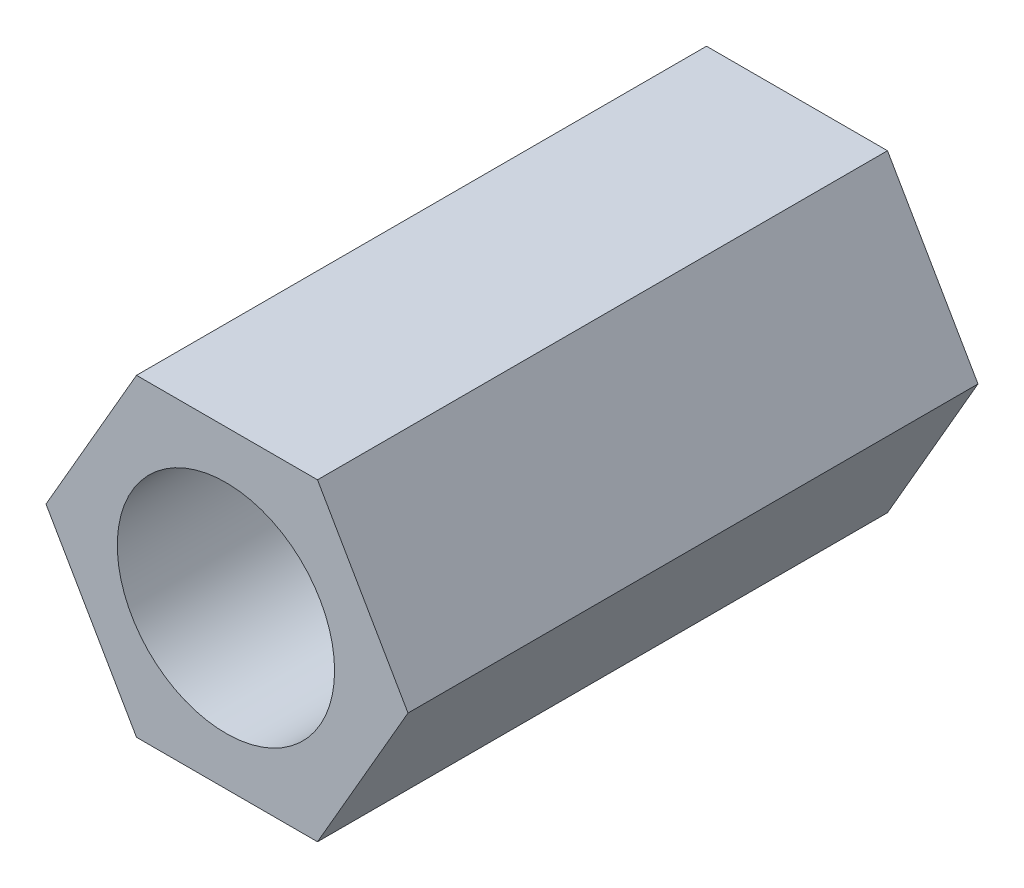
ISO-10303-21;
HEADER;
FILE_DESCRIPTION(('STEP AP214'),'2;1');
FILE_NAME('part.step','',(''),(''),'','','');
FILE_SCHEMA(('AUTOMOTIVE_DESIGN { 1 0 10303 214 1 1 1 1 }'));
ENDSEC;
DATA;
#1=APPLICATION_CONTEXT('core data for automotive mechanical design processes');
#2=APPLICATION_PROTOCOL_DEFINITION('international standard','automotive_design',2000,#1);
#3=PRODUCT_CONTEXT('',#1,'mechanical');
#4=PRODUCT('Part','Part','',(#3));
#5=PRODUCT_RELATED_PRODUCT_CATEGORY('part','',(#4));
#6=PRODUCT_DEFINITION_FORMATION('','',#4);
#7=PRODUCT_DEFINITION_CONTEXT('part definition',#1,'design');
#8=PRODUCT_DEFINITION('design','',#6,#7);
#9=PRODUCT_DEFINITION_SHAPE('','',#8);
#10=(LENGTH_UNIT() NAMED_UNIT(*) SI_UNIT(.MILLI.,.METRE.));
#11=(NAMED_UNIT(*) PLANE_ANGLE_UNIT() SI_UNIT($,.RADIAN.));
#12=(NAMED_UNIT(*) SI_UNIT($,.STERADIAN.) SOLID_ANGLE_UNIT());
#13=UNCERTAINTY_MEASURE_WITH_UNIT(LENGTH_MEASURE(1.E-05),#10,'distance_accuracy_value','');
#14=(GEOMETRIC_REPRESENTATION_CONTEXT(3) GLOBAL_UNCERTAINTY_ASSIGNED_CONTEXT((#13)) GLOBAL_UNIT_ASSIGNED_CONTEXT((#10,
#11,#12)) REPRESENTATION_CONTEXT('',''));
#15=CARTESIAN_POINT('',(0.,0.,0.));
#16=DIRECTION('',(0.,0.,1.));
#17=DIRECTION('',(1.,0.,0.));
#18=AXIS2_PLACEMENT_3D('',#15,#16,#17);
#19=CARTESIAN_POINT('',(12.7017059221717,0.,40.));
#20=DIRECTION('',(-0.866025403784438,-0.500000000000001,0.));
#21=DIRECTION('',(0.500000000000001,-0.866025403784438,0.));
#22=AXIS2_PLACEMENT_3D('',#19,#20,#21);
#23=PLANE('',#22);
#24=DIRECTION('',(0.,0.,1.));
#25=VECTOR('',#24,1.);
#26=CARTESIAN_POINT('',(6.35085296108583,11.,40.));
#27=LINE('',#26,#25);
#28=CARTESIAN_POINT('',(6.35085296108583,11.,0.));
#29=VERTEX_POINT('',#28);
#30=CARTESIAN_POINT('',(6.35085296108583,11.,40.));
#31=VERTEX_POINT('',#30);
#32=EDGE_CURVE('E46',#29,#31,#27,.T.);
#33=ORIENTED_EDGE('',*,*,#32,.T.);
#34=DIRECTION('',(-0.500000000000001,0.866025403784438,0.));
#35=VECTOR('',#34,1.);
#36=CARTESIAN_POINT('',(12.7017059221717,0.,40.));
#37=LINE('',#36,#35);
#38=CARTESIAN_POINT('',(12.7017059221717,0.,40.));
#39=VERTEX_POINT('',#38);
#40=EDGE_CURVE('E95',#39,#31,#37,.T.);
#41=ORIENTED_EDGE('',*,*,#40,.F.);
#42=DIRECTION('',(0.,0.,1.));
#43=VECTOR('',#42,1.);
#44=CARTESIAN_POINT('',(12.7017059221717,0.,40.));
#45=LINE('',#44,#43);
#46=CARTESIAN_POINT('',(12.7017059221717,0.,0.));
#47=VERTEX_POINT('',#46);
#48=EDGE_CURVE('E101',#39,#47,#45,.F.);
#49=ORIENTED_EDGE('',*,*,#48,.T.);
#50=DIRECTION('',(-0.500000000000001,0.866025403784438,0.));
#51=VECTOR('',#50,1.);
#52=CARTESIAN_POINT('',(12.7017059221717,0.,0.));
#53=LINE('',#52,#51);
#54=EDGE_CURVE('E150',#47,#29,#53,.T.);
#55=ORIENTED_EDGE('',*,*,#54,.T.);
#56=EDGE_LOOP('',(#33,#41,#49,#55));
#57=FACE_BOUND('',#56,.T.);
#58=ADVANCED_FACE('F43',(#57),#23,.F.);
#59=CARTESIAN_POINT('',(6.35085296108583,11.,40.));
#60=DIRECTION('',(0.,-1.,0.));
#61=DIRECTION('',(1.,0.,0.));
#62=AXIS2_PLACEMENT_3D('',#59,#60,#61);
#63=PLANE('',#62);
#64=DIRECTION('',(0.,0.,1.));
#65=VECTOR('',#64,1.);
#66=CARTESIAN_POINT('',(-6.35085296108591,10.9999999999999,40.));
#67=LINE('',#66,#65);
#68=CARTESIAN_POINT('',(-6.3508529610859,10.9999999999999,0.));
#69=VERTEX_POINT('',#68);
#70=CARTESIAN_POINT('',(-6.3508529610859,10.9999999999999,40.));
#71=VERTEX_POINT('',#70);
#72=EDGE_CURVE('E109',#69,#71,#67,.T.);
#73=ORIENTED_EDGE('',*,*,#72,.T.);
#74=DIRECTION('',(1.,0.,0.));
#75=VECTOR('',#74,1.);
#76=CARTESIAN_POINT('',(0.,11.,40.));
#77=LINE('',#76,#75);
#78=EDGE_CURVE('E118',#31,#71,#77,.F.);
#79=ORIENTED_EDGE('',*,*,#78,.F.);
#80=ORIENTED_EDGE('',*,*,#32,.F.);
#81=DIRECTION('',(1.,0.,0.));
#82=VECTOR('',#81,1.);
#83=CARTESIAN_POINT('',(0.,11.,0.));
#84=LINE('',#83,#82);
#85=EDGE_CURVE('E146',#29,#69,#84,.F.);
#86=ORIENTED_EDGE('',*,*,#85,.T.);
#87=EDGE_LOOP('',(#73,#79,#80,#86));
#88=FACE_BOUND('',#87,.T.);
#89=ADVANCED_FACE('F285',(#88),#63,.F.);
#90=CARTESIAN_POINT('',(6.35085296108599,-10.9999999999999,40.));
#91=DIRECTION('',(-0.866025403784442,0.499999999999995,0.));
#92=DIRECTION('',(-0.499999999999995,-0.866025403784442,0.));
#93=AXIS2_PLACEMENT_3D('',#90,#91,#92);
#94=PLANE('',#93);
#95=ORIENTED_EDGE('',*,*,#48,.F.);
#96=DIRECTION('',(0.499999999999995,0.866025403784442,0.));
#97=VECTOR('',#96,1.);
#98=CARTESIAN_POINT('',(6.35085296108599,-10.9999999999999,40.));
#99=LINE('',#98,#97);
#100=CARTESIAN_POINT('',(6.35085296108595,-11.,40.));
#101=VERTEX_POINT('',#100);
#102=EDGE_CURVE('E103',#101,#39,#99,.T.);
#103=ORIENTED_EDGE('',*,*,#102,.F.);
#104=DIRECTION('',(0.,0.,1.));
#105=VECTOR('',#104,1.);
#106=CARTESIAN_POINT('',(6.35085296108599,-10.9999999999999,40.));
#107=LINE('',#106,#105);
#108=CARTESIAN_POINT('',(6.35085296108597,-10.9999999999999,0.));
#109=VERTEX_POINT('',#108);
#110=EDGE_CURVE('E153',#101,#109,#107,.F.);
#111=ORIENTED_EDGE('',*,*,#110,.T.);
#112=DIRECTION('',(0.499999999999995,0.866025403784442,0.));
#113=VECTOR('',#112,1.);
#114=CARTESIAN_POINT('',(6.35085296108599,-10.9999999999999,0.));
#115=LINE('',#114,#113);
#116=EDGE_CURVE('E105',#109,#47,#115,.T.);
#117=ORIENTED_EDGE('',*,*,#116,.T.);
#118=EDGE_LOOP('',(#95,#103,#111,#117));
#119=FACE_BOUND('',#118,.T.);
#120=ADVANCED_FACE('F102',(#119),#94,.F.);
#121=CARTESIAN_POINT('',(-6.35085296108591,10.9999999999999,40.));
#122=DIRECTION('',(0.866025403784442,-0.499999999999995,0.));
#123=DIRECTION('',(0.499999999999995,0.866025403784442,0.));
#124=AXIS2_PLACEMENT_3D('',#121,#122,#123);
#125=PLANE('',#124);
#126=DIRECTION('',(0.,0.,1.));
#127=VECTOR('',#126,1.);
#128=CARTESIAN_POINT('',(-12.7017059221717,0.,40.));
#129=LINE('',#128,#127);
#130=CARTESIAN_POINT('',(-12.7017059221717,0.,0.));
#131=VERTEX_POINT('',#130);
#132=CARTESIAN_POINT('',(-12.7017059221717,0.,40.));
#133=VERTEX_POINT('',#132);
#134=EDGE_CURVE('E168',#131,#133,#129,.T.);
#135=ORIENTED_EDGE('',*,*,#134,.T.);
#136=DIRECTION('',(-0.499999999999995,-0.866025403784442,0.));
#137=VECTOR('',#136,1.);
#138=CARTESIAN_POINT('',(-6.35085296108591,10.9999999999999,40.));
#139=LINE('',#138,#137);
#140=EDGE_CURVE('E123',#71,#133,#139,.T.);
#141=ORIENTED_EDGE('',*,*,#140,.F.);
#142=ORIENTED_EDGE('',*,*,#72,.F.);
#143=DIRECTION('',(-0.499999999999995,-0.866025403784442,0.));
#144=VECTOR('',#143,1.);
#145=CARTESIAN_POINT('',(-6.35085296108591,10.9999999999999,0.));
#146=LINE('',#145,#144);
#147=EDGE_CURVE('E142',#69,#131,#146,.T.);
#148=ORIENTED_EDGE('',*,*,#147,.T.);
#149=EDGE_LOOP('',(#135,#141,#142,#148));
#150=FACE_BOUND('',#149,.T.);
#151=ADVANCED_FACE('F172',(#150),#125,.F.);
#152=CARTESIAN_POINT('',(0.,0.,40.));
#153=DIRECTION('',(0.,0.,1.));
#154=DIRECTION('',(1.,0.,0.));
#155=AXIS2_PLACEMENT_3D('',#152,#153,#154);
#156=PLANE('',#155);
#157=CARTESIAN_POINT('',(-0.0748247013808087,0.,40.));
#158=DIRECTION('',(0.,0.,1.));
#159=DIRECTION('',(1.,0.,0.));
#160=AXIS2_PLACEMENT_3D('',#157,#158,#159);
#161=CIRCLE('',#160,7.62482470138081);
#162=CARTESIAN_POINT('',(7.55,0.,40.));
#163=VERTEX_POINT('',#162);
#164=EDGE_CURVE('E182',#163,#163,#161,.T.);
#165=ORIENTED_EDGE('',*,*,#164,.F.);
#166=EDGE_LOOP('',(#165));
#167=FACE_BOUND('',#166,.T.);
#168=DIRECTION('',(-0.500000000000007,0.866025403784435,0.));
#169=VECTOR('',#168,1.);
#170=CARTESIAN_POINT('',(-12.7017059221717,0.,40.));
#171=LINE('',#170,#169);
#172=CARTESIAN_POINT('',(-6.35085296108576,-11.,40.));
#173=VERTEX_POINT('',#172);
#174=EDGE_CURVE('E162',#133,#173,#171,.F.);
#175=ORIENTED_EDGE('',*,*,#174,.T.);
#176=DIRECTION('',(-1.,0.,0.));
#177=VECTOR('',#176,1.);
#178=CARTESIAN_POINT('',(-6.35085296108576,-11.,40.));
#179=LINE('',#178,#177);
#180=EDGE_CURVE('E113',#173,#101,#179,.F.);
#181=ORIENTED_EDGE('',*,*,#180,.T.);
#182=ORIENTED_EDGE('',*,*,#102,.T.);
#183=ORIENTED_EDGE('',*,*,#40,.T.);
#184=ORIENTED_EDGE('',*,*,#78,.T.);
#185=ORIENTED_EDGE('',*,*,#140,.T.);
#186=EDGE_LOOP('',(#175,#181,#182,#183,#184,#185));
#187=FACE_BOUND('',#186,.T.);
#188=ADVANCED_FACE('F112',(#167,#187),#156,.T.);
#189=CARTESIAN_POINT('',(-6.35085296108576,-11.,40.));
#190=DIRECTION('',(0.,1.,0.));
#191=DIRECTION('',(-1.,0.,0.));
#192=AXIS2_PLACEMENT_3D('',#189,#190,#191);
#193=PLANE('',#192);
#194=ORIENTED_EDGE('',*,*,#110,.F.);
#195=ORIENTED_EDGE('',*,*,#180,.F.);
#196=DIRECTION('',(0.,0.,1.));
#197=VECTOR('',#196,1.);
#198=CARTESIAN_POINT('',(-6.35085296108576,-11.,40.));
#199=LINE('',#198,#197);
#200=CARTESIAN_POINT('',(-6.35085296108576,-11.,0.));
#201=VERTEX_POINT('',#200);
#202=EDGE_CURVE('E54',#173,#201,#199,.F.);
#203=ORIENTED_EDGE('',*,*,#202,.T.);
#204=DIRECTION('',(1.,0.,0.));
#205=VECTOR('',#204,1.);
#206=CARTESIAN_POINT('',(0.,-11.,0.));
#207=LINE('',#206,#205);
#208=EDGE_CURVE('E62',#201,#109,#207,.T.);
#209=ORIENTED_EDGE('',*,*,#208,.T.);
#210=EDGE_LOOP('',(#194,#195,#203,#209));
#211=FACE_BOUND('',#210,.T.);
#212=ADVANCED_FACE('F243',(#211),#193,.F.);
#213=CARTESIAN_POINT('',(0.,0.,0.));
#214=DIRECTION('',(0.,0.,1.));
#215=DIRECTION('',(1.,0.,0.));
#216=AXIS2_PLACEMENT_3D('',#213,#214,#215);
#217=PLANE('',#216);
#218=CARTESIAN_POINT('',(-0.0748247013808087,0.,0.));
#219=DIRECTION('',(0.,0.,1.));
#220=DIRECTION('',(1.,0.,0.));
#221=AXIS2_PLACEMENT_3D('',#218,#219,#220);
#222=CIRCLE('',#221,5.99045948307911);
#223=CARTESIAN_POINT('',(5.9156347816983,0.,0.));
#224=VERTEX_POINT('',#223);
#225=EDGE_CURVE('E200',#224,#224,#222,.T.);
#226=ORIENTED_EDGE('',*,*,#225,.T.);
#227=EDGE_LOOP('',(#226));
#228=FACE_BOUND('',#227,.T.);
#229=ORIENTED_EDGE('',*,*,#208,.F.);
#230=DIRECTION('',(-0.500000000000007,0.866025403784435,0.));
#231=VECTOR('',#230,1.);
#232=CARTESIAN_POINT('',(-12.7017059221717,0.,0.));
#233=LINE('',#232,#231);
#234=EDGE_CURVE('E12',#201,#131,#233,.T.);
#235=ORIENTED_EDGE('',*,*,#234,.T.);
#236=ORIENTED_EDGE('',*,*,#147,.F.);
#237=ORIENTED_EDGE('',*,*,#85,.F.);
#238=ORIENTED_EDGE('',*,*,#54,.F.);
#239=ORIENTED_EDGE('',*,*,#116,.F.);
#240=EDGE_LOOP('',(#229,#235,#236,#237,#238,#239));
#241=FACE_BOUND('',#240,.T.);
#242=ADVANCED_FACE('F204',(#228,#241),#217,.F.);
#243=CARTESIAN_POINT('',(-12.7017059221717,0.,40.));
#244=DIRECTION('',(0.866025403784435,0.500000000000007,0.));
#245=DIRECTION('',(-0.500000000000007,0.866025403784435,0.));
#246=AXIS2_PLACEMENT_3D('',#243,#244,#245);
#247=PLANE('',#246);
#248=ORIENTED_EDGE('',*,*,#202,.F.);
#249=ORIENTED_EDGE('',*,*,#174,.F.);
#250=ORIENTED_EDGE('',*,*,#134,.F.);
#251=ORIENTED_EDGE('',*,*,#234,.F.);
#252=EDGE_LOOP('',(#248,#249,#250,#251));
#253=FACE_BOUND('',#252,.T.);
#254=ADVANCED_FACE('F167',(#253),#247,.F.);
#255=CARTESIAN_POINT('',(-0.0748247013808087,0.,0.317458212434539));
#256=DIRECTION('',(0.,0.,1.));
#257=DIRECTION('',(1.,0.,0.));
#258=AXIS2_PLACEMENT_3D('',#255,#256,#257);
#259=CYLINDRICAL_SURFACE('',#258,7.62482470138081);
#260=CARTESIAN_POINT('',(-0.0748247013808087,0.,25.17));
#261=DIRECTION('',(0.,0.,1.));
#262=DIRECTION('',(1.,0.,0.));
#263=AXIS2_PLACEMENT_3D('',#260,#261,#262);
#264=CIRCLE('',#263,7.62482470138081);
#265=CARTESIAN_POINT('',(7.55,0.,25.17));
#266=VERTEX_POINT('',#265);
#267=EDGE_CURVE('E185',#266,#266,#264,.T.);
#268=ORIENTED_EDGE('',*,*,#267,.F.);
#269=EDGE_LOOP('',(#268));
#270=FACE_BOUND('',#269,.T.);
#271=ORIENTED_EDGE('',*,*,#164,.T.);
#272=EDGE_LOOP('',(#271));
#273=FACE_BOUND('',#272,.T.);
#274=ADVANCED_FACE('F233',(#270,#273),#259,.F.);
#275=CARTESIAN_POINT('',(7.55,0.,25.17));
#276=DIRECTION('',(0.,0.,-1.));
#277=DIRECTION('',(-1.,0.,0.));
#278=AXIS2_PLACEMENT_3D('',#275,#276,#277);
#279=PLANE('',#278);
#280=CARTESIAN_POINT('',(-0.0748247013808087,0.,25.17));
#281=DIRECTION('',(0.,0.,1.));
#282=DIRECTION('',(1.,0.,0.));
#283=AXIS2_PLACEMENT_3D('',#280,#281,#282);
#284=CIRCLE('',#283,5.07482470138081);
#285=CARTESIAN_POINT('',(5.,0.,25.17));
#286=VERTEX_POINT('',#285);
#287=EDGE_CURVE('E188',#286,#286,#284,.T.);
#288=ORIENTED_EDGE('',*,*,#287,.F.);
#289=EDGE_LOOP('',(#288));
#290=FACE_BOUND('',#289,.T.);
#291=ORIENTED_EDGE('',*,*,#267,.T.);
#292=EDGE_LOOP('',(#291));
#293=FACE_BOUND('',#292,.T.);
#294=ADVANCED_FACE('F227',(#290,#293),#279,.F.);
#295=CARTESIAN_POINT('',(-0.0748247013808087,0.,0.317458212434539));
#296=DIRECTION('',(0.,0.,1.));
#297=DIRECTION('',(1.,0.,0.));
#298=AXIS2_PLACEMENT_3D('',#295,#296,#297);
#299=CYLINDRICAL_SURFACE('',#298,5.07482470138081);
#300=CARTESIAN_POINT('',(-0.0748247013808087,0.,21.69));
#301=DIRECTION('',(0.,0.,1.));
#302=DIRECTION('',(1.,0.,0.));
#303=AXIS2_PLACEMENT_3D('',#300,#301,#302);
#304=CIRCLE('',#303,5.07482470138081);
#305=CARTESIAN_POINT('',(5.,0.,21.69));
#306=VERTEX_POINT('',#305);
#307=EDGE_CURVE('E191',#306,#306,#304,.T.);
#308=ORIENTED_EDGE('',*,*,#307,.F.);
#309=EDGE_LOOP('',(#308));
#310=FACE_BOUND('',#309,.T.);
#311=ORIENTED_EDGE('',*,*,#287,.T.);
#312=EDGE_LOOP('',(#311));
#313=FACE_BOUND('',#312,.T.);
#314=ADVANCED_FACE('F221',(#310,#313),#299,.F.);
#315=CARTESIAN_POINT('',(-0.0748247013808087,0.,21.69));
#316=DIRECTION('',(0.,0.,1.));
#317=DIRECTION('',(1.,0.,0.));
#318=AXIS2_PLACEMENT_3D('',#315,#316,#317);
#319=TOROIDAL_SURFACE('',#318,3.07482470138081,2.);
#320=CARTESIAN_POINT('',(-0.0748247013808087,0.,19.8819693033579));
#321=DIRECTION('',(0.,0.,1.));
#322=DIRECTION('',(1.,0.,0.));
#323=AXIS2_PLACEMENT_3D('',#320,#321,#322);
#324=CIRCLE('',#323,3.92982470138081);
#325=CARTESIAN_POINT('',(3.855,0.,19.8819693033579));
#326=VERTEX_POINT('',#325);
#327=EDGE_CURVE('E194',#326,#326,#324,.T.);
#328=ORIENTED_EDGE('',*,*,#327,.F.);
#329=EDGE_LOOP('',(#328));
#330=FACE_BOUND('',#329,.T.);
#331=ORIENTED_EDGE('',*,*,#307,.T.);
#332=EDGE_LOOP('',(#331));
#333=FACE_BOUND('',#332,.T.);
#334=ADVANCED_FACE('F215',(#330,#333),#319,.F.);
#335=CARTESIAN_POINT('',(-0.0748247013808087,0.,17.0704815700795));
#336=DIRECTION('',(0.,0.,1.));
#337=DIRECTION('',(1.,0.,0.));
#338=AXIS2_PLACEMENT_3D('',#335,#336,#337);
#339=TOROIDAL_SURFACE('',#338,5.25934970138081,3.11);
#340=CARTESIAN_POINT('',(-0.0748247013808087,0.,15.872910621726));
#341=DIRECTION('',(0.,0.,1.));
#342=DIRECTION('',(1.,0.,0.));
#343=AXIS2_PLACEMENT_3D('',#340,#341,#342);
#344=CIRCLE('',#343,2.38917134043183);
#345=CARTESIAN_POINT('',(2.31434663905102,0.,15.872910621726));
#346=VERTEX_POINT('',#345);
#347=EDGE_CURVE('E197',#346,#346,#344,.T.);
#348=ORIENTED_EDGE('',*,*,#347,.F.);
#349=EDGE_LOOP('',(#348));
#350=FACE_BOUND('',#349,.T.);
#351=ORIENTED_EDGE('',*,*,#327,.T.);
#352=EDGE_LOOP('',(#351));
#353=FACE_BOUND('',#352,.T.);
#354=ADVANCED_FACE('F209',(#350,#353),#339,.T.);
#355=CARTESIAN_POINT('',(-0.0748247013808087,0.,-2.41796399138989));
#356=DIRECTION('',(0.,0.,1.));
#357=DIRECTION('',(1.,0.,0.));
#358=AXIS2_PLACEMENT_3D('',#355,#356,#357);
#359=DEGENERATE_TOROIDAL_SURFACE('',#358,41.4479579666666,47.5,.F.);
#360=ORIENTED_EDGE('',*,*,#225,.F.);
#361=EDGE_LOOP('',(#360));
#362=FACE_BOUND('',#361,.T.);
#363=ORIENTED_EDGE('',*,*,#347,.T.);
#364=EDGE_LOOP('',(#363));
#365=FACE_BOUND('',#364,.T.);
#366=ADVANCED_FACE('F206',(#362,#365),#359,.T.);
#367=CLOSED_SHELL('',(#58,#89,#120,#151,#188,#212,#242,#254,#274,#294,#314,#334,#354,#366));
#368=MANIFOLD_SOLID_BREP('B2',#367);
#369=ADVANCED_BREP_SHAPE_REPRESENTATION('',(#18,#368),#14);
#370=SHAPE_DEFINITION_REPRESENTATION(#9,#369);
ENDSEC;
END-ISO-10303-21;
